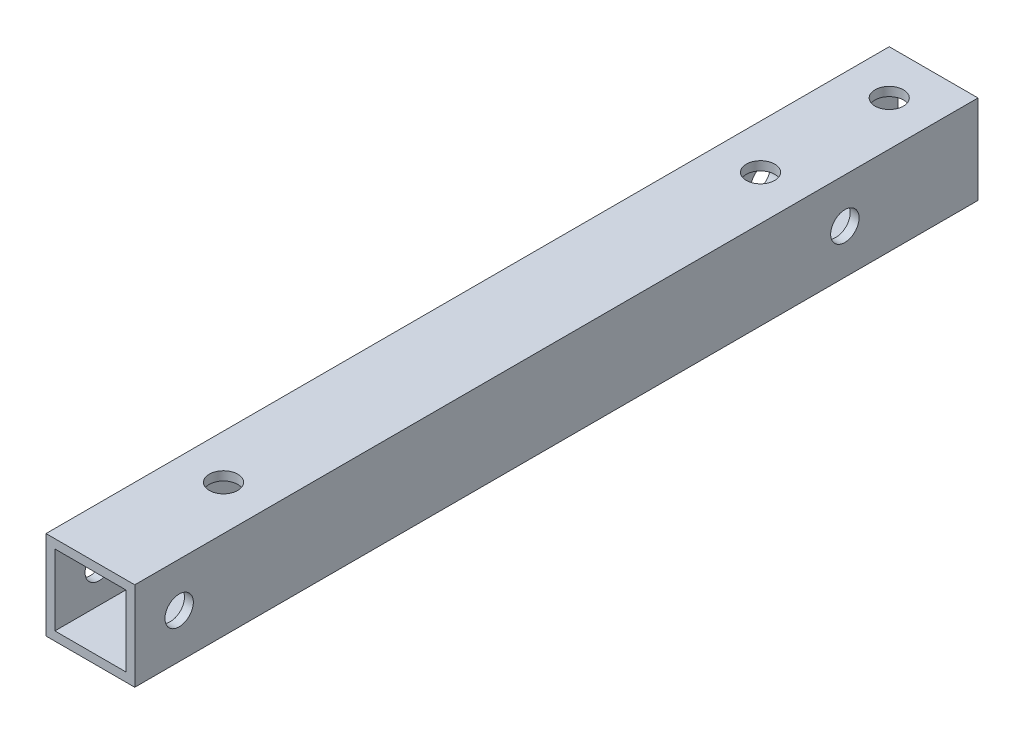
ISO-10303-21;
HEADER;
FILE_DESCRIPTION(('STEP AP214'),'2;1');
FILE_NAME('part.step','',(''),(''),'','','');
FILE_SCHEMA(('AUTOMOTIVE_DESIGN { 1 0 10303 214 1 1 1 1 }'));
ENDSEC;
DATA;
#1=APPLICATION_CONTEXT('core data for automotive mechanical design processes');
#2=APPLICATION_PROTOCOL_DEFINITION('international standard','automotive_design',2000,#1);
#3=PRODUCT_CONTEXT('',#1,'mechanical');
#4=PRODUCT('Part','Part','',(#3));
#5=PRODUCT_RELATED_PRODUCT_CATEGORY('part','',(#4));
#6=PRODUCT_DEFINITION_FORMATION('','',#4);
#7=PRODUCT_DEFINITION_CONTEXT('part definition',#1,'design');
#8=PRODUCT_DEFINITION('design','',#6,#7);
#9=PRODUCT_DEFINITION_SHAPE('','',#8);
#10=(LENGTH_UNIT() NAMED_UNIT(*) SI_UNIT(.MILLI.,.METRE.));
#11=(NAMED_UNIT(*) PLANE_ANGLE_UNIT() SI_UNIT($,.RADIAN.));
#12=(NAMED_UNIT(*) SI_UNIT($,.STERADIAN.) SOLID_ANGLE_UNIT());
#13=UNCERTAINTY_MEASURE_WITH_UNIT(LENGTH_MEASURE(1.E-05),#10,'distance_accuracy_value','');
#14=(GEOMETRIC_REPRESENTATION_CONTEXT(3) GLOBAL_UNCERTAINTY_ASSIGNED_CONTEXT((#13)) GLOBAL_UNIT_ASSIGNED_CONTEXT((#10,
#11,#12)) REPRESENTATION_CONTEXT('',''));
#15=CARTESIAN_POINT('',(0.,0.,0.));
#16=DIRECTION('',(0.,0.,1.));
#17=DIRECTION('',(1.,0.,0.));
#18=AXIS2_PLACEMENT_3D('',#15,#16,#17);
#19=CARTESIAN_POINT('',(0.,0.,95.));
#20=DIRECTION('',(0.,0.,1.));
#21=DIRECTION('',(1.,0.,0.));
#22=AXIS2_PLACEMENT_3D('',#19,#20,#21);
#23=PLANE('',#22);
#24=DIRECTION('',(0.,1.,0.));
#25=VECTOR('',#24,1.);
#26=CARTESIAN_POINT('',(5.00000000000001,4.99999999999999,95.));
#27=LINE('',#26,#25);
#28=CARTESIAN_POINT('',(5.00000000000001,-5.,95.));
#29=VERTEX_POINT('',#28);
#30=CARTESIAN_POINT('',(5.00000000000001,4.99999999999999,95.));
#31=VERTEX_POINT('',#30);
#32=EDGE_CURVE('E146',#29,#31,#27,.T.);
#33=ORIENTED_EDGE('',*,*,#32,.T.);
#34=DIRECTION('',(-1.,0.,0.));
#35=VECTOR('',#34,1.);
#36=CARTESIAN_POINT('',(-4.99999999999999,4.99999999999999,95.));
#37=LINE('',#36,#35);
#38=CARTESIAN_POINT('',(-4.99999999999999,4.99999999999999,95.));
#39=VERTEX_POINT('',#38);
#40=EDGE_CURVE('E149',#31,#39,#37,.T.);
#41=ORIENTED_EDGE('',*,*,#40,.T.);
#42=DIRECTION('',(0.,-1.,0.));
#43=VECTOR('',#42,1.);
#44=CARTESIAN_POINT('',(-4.99999999999999,4.99999999999999,95.));
#45=LINE('',#44,#43);
#46=CARTESIAN_POINT('',(-4.99999999999999,-5.,95.));
#47=VERTEX_POINT('',#46);
#48=EDGE_CURVE('E152',#39,#47,#45,.T.);
#49=ORIENTED_EDGE('',*,*,#48,.T.);
#50=DIRECTION('',(1.,0.,0.));
#51=VECTOR('',#50,1.);
#52=CARTESIAN_POINT('',(-4.99999999999999,-5.,95.));
#53=LINE('',#52,#51);
#54=EDGE_CURVE('E154',#47,#29,#53,.T.);
#55=ORIENTED_EDGE('',*,*,#54,.T.);
#56=EDGE_LOOP('',(#33,#41,#49,#55));
#57=FACE_BOUND('',#56,.T.);
#58=DIRECTION('',(-1.,0.,0.));
#59=VECTOR('',#58,1.);
#60=CARTESIAN_POINT('',(-4.,4.,95.));
#61=LINE('',#60,#59);
#62=CARTESIAN_POINT('',(4.,4.,95.));
#63=VERTEX_POINT('',#62);
#64=CARTESIAN_POINT('',(-4.,4.,95.));
#65=VERTEX_POINT('',#64);
#66=EDGE_CURVE('E116',#63,#65,#61,.T.);
#67=ORIENTED_EDGE('',*,*,#66,.F.);
#68=DIRECTION('',(0.,1.,0.));
#69=VECTOR('',#68,1.);
#70=CARTESIAN_POINT('',(4.,4.,95.));
#71=LINE('',#70,#69);
#72=CARTESIAN_POINT('',(4.,-4.,95.));
#73=VERTEX_POINT('',#72);
#74=EDGE_CURVE('E108',#73,#63,#71,.T.);
#75=ORIENTED_EDGE('',*,*,#74,.F.);
#76=DIRECTION('',(1.,0.,0.));
#77=VECTOR('',#76,1.);
#78=CARTESIAN_POINT('',(-4.,-4.,95.));
#79=LINE('',#78,#77);
#80=CARTESIAN_POINT('',(-4.,-4.,95.));
#81=VERTEX_POINT('',#80);
#82=EDGE_CURVE('E130',#81,#73,#79,.T.);
#83=ORIENTED_EDGE('',*,*,#82,.F.);
#84=DIRECTION('',(0.,-1.,0.));
#85=VECTOR('',#84,1.);
#86=CARTESIAN_POINT('',(-4.,4.,95.));
#87=LINE('',#86,#85);
#88=EDGE_CURVE('E128',#65,#81,#87,.T.);
#89=ORIENTED_EDGE('',*,*,#88,.F.);
#90=EDGE_LOOP('',(#67,#75,#83,#89));
#91=FACE_BOUND('',#90,.T.);
#92=ADVANCED_FACE('F41',(#57,#91),#23,.T.);
#93=CARTESIAN_POINT('',(0.,0.,0.));
#94=DIRECTION('',(0.,0.,1.));
#95=DIRECTION('',(1.,0.,0.));
#96=AXIS2_PLACEMENT_3D('',#93,#94,#95);
#97=PLANE('',#96);
#98=DIRECTION('',(0.,1.,0.));
#99=VECTOR('',#98,1.);
#100=CARTESIAN_POINT('',(5.00000000000001,4.99999999999999,0.));
#101=LINE('',#100,#99);
#102=CARTESIAN_POINT('',(5.00000000000001,-5.,0.));
#103=VERTEX_POINT('',#102);
#104=CARTESIAN_POINT('',(5.00000000000001,4.99999999999999,0.));
#105=VERTEX_POINT('',#104);
#106=EDGE_CURVE('E124',#103,#105,#101,.T.);
#107=ORIENTED_EDGE('',*,*,#106,.F.);
#108=DIRECTION('',(1.,0.,0.));
#109=VECTOR('',#108,1.);
#110=CARTESIAN_POINT('',(-4.99999999999999,-5.,0.));
#111=LINE('',#110,#109);
#112=CARTESIAN_POINT('',(-4.99999999999999,-5.,0.));
#113=VERTEX_POINT('',#112);
#114=EDGE_CURVE('E150',#113,#103,#111,.T.);
#115=ORIENTED_EDGE('',*,*,#114,.F.);
#116=DIRECTION('',(0.,-1.,0.));
#117=VECTOR('',#116,1.);
#118=CARTESIAN_POINT('',(-4.99999999999999,4.99999999999999,0.));
#119=LINE('',#118,#117);
#120=CARTESIAN_POINT('',(-4.99999999999999,4.99999999999999,0.));
#121=VERTEX_POINT('',#120);
#122=EDGE_CURVE('E161',#121,#113,#119,.T.);
#123=ORIENTED_EDGE('',*,*,#122,.F.);
#124=DIRECTION('',(-1.,0.,0.));
#125=VECTOR('',#124,1.);
#126=CARTESIAN_POINT('',(-4.99999999999999,4.99999999999999,0.));
#127=LINE('',#126,#125);
#128=EDGE_CURVE('E159',#105,#121,#127,.T.);
#129=ORIENTED_EDGE('',*,*,#128,.F.);
#130=EDGE_LOOP('',(#107,#115,#123,#129));
#131=FACE_BOUND('',#130,.T.);
#132=DIRECTION('',(0.,1.,0.));
#133=VECTOR('',#132,1.);
#134=CARTESIAN_POINT('',(4.,4.,0.));
#135=LINE('',#134,#133);
#136=CARTESIAN_POINT('',(4.,-4.,0.));
#137=VERTEX_POINT('',#136);
#138=CARTESIAN_POINT('',(4.,4.,0.));
#139=VERTEX_POINT('',#138);
#140=EDGE_CURVE('E66',#137,#139,#135,.T.);
#141=ORIENTED_EDGE('',*,*,#140,.T.);
#142=DIRECTION('',(-1.,0.,0.));
#143=VECTOR('',#142,1.);
#144=CARTESIAN_POINT('',(-4.,4.,0.));
#145=LINE('',#144,#143);
#146=CARTESIAN_POINT('',(-4.,4.,0.));
#147=VERTEX_POINT('',#146);
#148=EDGE_CURVE('E123',#139,#147,#145,.T.);
#149=ORIENTED_EDGE('',*,*,#148,.T.);
#150=DIRECTION('',(0.,-1.,0.));
#151=VECTOR('',#150,1.);
#152=CARTESIAN_POINT('',(-4.,4.,0.));
#153=LINE('',#152,#151);
#154=CARTESIAN_POINT('',(-4.,-4.,0.));
#155=VERTEX_POINT('',#154);
#156=EDGE_CURVE('E138',#147,#155,#153,.T.);
#157=ORIENTED_EDGE('',*,*,#156,.T.);
#158=DIRECTION('',(1.,0.,0.));
#159=VECTOR('',#158,1.);
#160=CARTESIAN_POINT('',(-4.,-4.,0.));
#161=LINE('',#160,#159);
#162=EDGE_CURVE('E117',#155,#137,#161,.T.);
#163=ORIENTED_EDGE('',*,*,#162,.T.);
#164=EDGE_LOOP('',(#141,#149,#157,#163));
#165=FACE_BOUND('',#164,.T.);
#166=ADVANCED_FACE('F264',(#131,#165),#97,.F.);
#167=CARTESIAN_POINT('',(5.00000000000001,4.99999999999999,95.));
#168=DIRECTION('',(-1.,0.,0.));
#169=DIRECTION('',(0.,-1.,0.));
#170=AXIS2_PLACEMENT_3D('',#167,#168,#169);
#171=PLANE('',#170);
#172=CARTESIAN_POINT('',(5.00000000000001,0.,15.));
#173=DIRECTION('',(-1.,0.,0.));
#174=DIRECTION('',(0.,0.,1.));
#175=AXIS2_PLACEMENT_3D('',#172,#173,#174);
#176=CIRCLE('',#175,1.6);
#177=CARTESIAN_POINT('',(5.00000000000001,0.,16.6));
#178=VERTEX_POINT('',#177);
#179=EDGE_CURVE('E185',#178,#178,#176,.T.);
#180=ORIENTED_EDGE('',*,*,#179,.T.);
#181=EDGE_LOOP('',(#180));
#182=FACE_BOUND('',#181,.T.);
#183=CARTESIAN_POINT('',(5.00000000000001,0.,90.));
#184=DIRECTION('',(-1.,0.,0.));
#185=DIRECTION('',(0.,0.,1.));
#186=AXIS2_PLACEMENT_3D('',#183,#184,#185);
#187=CIRCLE('',#186,1.60000000000001);
#188=CARTESIAN_POINT('',(5.00000000000001,0.,91.6));
#189=VERTEX_POINT('',#188);
#190=EDGE_CURVE('E196',#189,#189,#187,.T.);
#191=ORIENTED_EDGE('',*,*,#190,.T.);
#192=EDGE_LOOP('',(#191));
#193=FACE_BOUND('',#192,.T.);
#194=ORIENTED_EDGE('',*,*,#106,.T.);
#195=DIRECTION('',(0.,0.,-1.));
#196=VECTOR('',#195,1.);
#197=CARTESIAN_POINT('',(5.00000000000001,4.99999999999999,95.));
#198=LINE('',#197,#196);
#199=EDGE_CURVE('E11',#31,#105,#198,.T.);
#200=ORIENTED_EDGE('',*,*,#199,.F.);
#201=ORIENTED_EDGE('',*,*,#32,.F.);
#202=DIRECTION('',(0.,0.,-1.));
#203=VECTOR('',#202,1.);
#204=CARTESIAN_POINT('',(5.00000000000001,-5.,95.));
#205=LINE('',#204,#203);
#206=EDGE_CURVE('E156',#29,#103,#205,.T.);
#207=ORIENTED_EDGE('',*,*,#206,.T.);
#208=EDGE_LOOP('',(#194,#200,#201,#207));
#209=FACE_BOUND('',#208,.T.);
#210=ADVANCED_FACE('F43',(#182,#193,#209),#171,.F.);
#211=CARTESIAN_POINT('',(-4.99999999999999,4.99999999999999,95.));
#212=DIRECTION('',(0.,-1.,0.));
#213=DIRECTION('',(0.,0.,-1.));
#214=AXIS2_PLACEMENT_3D('',#211,#212,#213);
#215=PLANE('',#214);
#216=CARTESIAN_POINT('',(0.,4.99999999999999,5.));
#217=DIRECTION('',(0.,1.,0.));
#218=DIRECTION('',(0.,0.,1.));
#219=AXIS2_PLACEMENT_3D('',#216,#217,#218);
#220=CIRCLE('',#219,1.6);
#221=CARTESIAN_POINT('',(0.,4.99999999999999,6.6));
#222=VERTEX_POINT('',#221);
#223=EDGE_CURVE('E210',#222,#222,#220,.T.);
#224=ORIENTED_EDGE('',*,*,#223,.F.);
#225=EDGE_LOOP('',(#224));
#226=FACE_BOUND('',#225,.T.);
#227=CARTESIAN_POINT('',(0.,4.99999999999999,80.));
#228=DIRECTION('',(0.,1.,0.));
#229=DIRECTION('',(0.,0.,1.));
#230=AXIS2_PLACEMENT_3D('',#227,#228,#229);
#231=CIRCLE('',#230,1.6);
#232=CARTESIAN_POINT('',(0.,4.99999999999999,81.6));
#233=VERTEX_POINT('',#232);
#234=EDGE_CURVE('E216',#233,#233,#231,.T.);
#235=ORIENTED_EDGE('',*,*,#234,.F.);
#236=EDGE_LOOP('',(#235));
#237=FACE_BOUND('',#236,.T.);
#238=CARTESIAN_POINT('',(0.,4.99999999999999,19.5));
#239=DIRECTION('',(0.,1.,0.));
#240=DIRECTION('',(0.,0.,1.));
#241=AXIS2_PLACEMENT_3D('',#238,#239,#240);
#242=CIRCLE('',#241,1.6);
#243=CARTESIAN_POINT('',(0.,4.99999999999999,21.1));
#244=VERTEX_POINT('',#243);
#245=EDGE_CURVE('E207',#244,#244,#242,.T.);
#246=ORIENTED_EDGE('',*,*,#245,.F.);
#247=EDGE_LOOP('',(#246));
#248=FACE_BOUND('',#247,.T.);
#249=ORIENTED_EDGE('',*,*,#128,.T.);
#250=DIRECTION('',(0.,0.,-1.));
#251=VECTOR('',#250,1.);
#252=CARTESIAN_POINT('',(-4.99999999999999,4.99999999999999,95.));
#253=LINE('',#252,#251);
#254=EDGE_CURVE('E50',#39,#121,#253,.T.);
#255=ORIENTED_EDGE('',*,*,#254,.F.);
#256=ORIENTED_EDGE('',*,*,#40,.F.);
#257=ORIENTED_EDGE('',*,*,#199,.T.);
#258=EDGE_LOOP('',(#249,#255,#256,#257));
#259=FACE_BOUND('',#258,.T.);
#260=ADVANCED_FACE('F250',(#226,#237,#248,#259),#215,.F.);
#261=CARTESIAN_POINT('',(-4.99999999999999,4.99999999999999,95.));
#262=DIRECTION('',(1.,0.,0.));
#263=DIRECTION('',(0.,1.,0.));
#264=AXIS2_PLACEMENT_3D('',#261,#262,#263);
#265=PLANE('',#264);
#266=CARTESIAN_POINT('',(-4.99999999999999,0.,15.));
#267=DIRECTION('',(-1.,0.,0.));
#268=DIRECTION('',(0.,0.,1.));
#269=AXIS2_PLACEMENT_3D('',#266,#267,#268);
#270=CIRCLE('',#269,1.6);
#271=CARTESIAN_POINT('',(-4.99999999999999,0.,16.6));
#272=VERTEX_POINT('',#271);
#273=EDGE_CURVE('E191',#272,#272,#270,.T.);
#274=ORIENTED_EDGE('',*,*,#273,.F.);
#275=EDGE_LOOP('',(#274));
#276=FACE_BOUND('',#275,.T.);
#277=CARTESIAN_POINT('',(-4.99999999999999,0.,90.));
#278=DIRECTION('',(-1.,0.,0.));
#279=DIRECTION('',(0.,0.,1.));
#280=AXIS2_PLACEMENT_3D('',#277,#278,#279);
#281=CIRCLE('',#280,1.60000000000001);
#282=CARTESIAN_POINT('',(-4.99999999999999,0.,91.6));
#283=VERTEX_POINT('',#282);
#284=EDGE_CURVE('E201',#283,#283,#281,.T.);
#285=ORIENTED_EDGE('',*,*,#284,.F.);
#286=EDGE_LOOP('',(#285));
#287=FACE_BOUND('',#286,.T.);
#288=ORIENTED_EDGE('',*,*,#122,.T.);
#289=DIRECTION('',(0.,0.,-1.));
#290=VECTOR('',#289,1.);
#291=CARTESIAN_POINT('',(-4.99999999999999,-5.,95.));
#292=LINE('',#291,#290);
#293=EDGE_CURVE('E166',#47,#113,#292,.T.);
#294=ORIENTED_EDGE('',*,*,#293,.F.);
#295=ORIENTED_EDGE('',*,*,#48,.F.);
#296=ORIENTED_EDGE('',*,*,#254,.T.);
#297=EDGE_LOOP('',(#288,#294,#295,#296));
#298=FACE_BOUND('',#297,.T.);
#299=ADVANCED_FACE('F253',(#276,#287,#298),#265,.F.);
#300=CARTESIAN_POINT('',(-4.99999999999999,-5.,95.));
#301=DIRECTION('',(0.,1.,0.));
#302=DIRECTION('',(0.,0.,1.));
#303=AXIS2_PLACEMENT_3D('',#300,#301,#302);
#304=PLANE('',#303);
#305=CARTESIAN_POINT('',(0.,-5.,5.));
#306=DIRECTION('',(0.,1.,0.));
#307=DIRECTION('',(0.,0.,1.));
#308=AXIS2_PLACEMENT_3D('',#305,#306,#307);
#309=CIRCLE('',#308,1.6);
#310=CARTESIAN_POINT('',(0.,-5.,6.6));
#311=VERTEX_POINT('',#310);
#312=EDGE_CURVE('E175',#311,#311,#309,.T.);
#313=ORIENTED_EDGE('',*,*,#312,.T.);
#314=EDGE_LOOP('',(#313));
#315=FACE_BOUND('',#314,.T.);
#316=CARTESIAN_POINT('',(0.,-5.,80.));
#317=DIRECTION('',(0.,1.,0.));
#318=DIRECTION('',(0.,0.,1.));
#319=AXIS2_PLACEMENT_3D('',#316,#317,#318);
#320=CIRCLE('',#319,1.6);
#321=CARTESIAN_POINT('',(0.,-5.,81.6));
#322=VERTEX_POINT('',#321);
#323=EDGE_CURVE('E213',#322,#322,#320,.T.);
#324=ORIENTED_EDGE('',*,*,#323,.T.);
#325=EDGE_LOOP('',(#324));
#326=FACE_BOUND('',#325,.T.);
#327=CARTESIAN_POINT('',(0.,-5.,19.5));
#328=DIRECTION('',(0.,1.,0.));
#329=DIRECTION('',(0.,0.,1.));
#330=AXIS2_PLACEMENT_3D('',#327,#328,#329);
#331=CIRCLE('',#330,1.6);
#332=CARTESIAN_POINT('',(0.,-5.,21.1));
#333=VERTEX_POINT('',#332);
#334=EDGE_CURVE('E219',#333,#333,#331,.T.);
#335=ORIENTED_EDGE('',*,*,#334,.T.);
#336=EDGE_LOOP('',(#335));
#337=FACE_BOUND('',#336,.T.);
#338=ORIENTED_EDGE('',*,*,#114,.T.);
#339=ORIENTED_EDGE('',*,*,#206,.F.);
#340=ORIENTED_EDGE('',*,*,#54,.F.);
#341=ORIENTED_EDGE('',*,*,#293,.T.);
#342=EDGE_LOOP('',(#338,#339,#340,#341));
#343=FACE_BOUND('',#342,.T.);
#344=ADVANCED_FACE('F268',(#315,#326,#337,#343),#304,.F.);
#345=CARTESIAN_POINT('',(4.,4.,95.));
#346=DIRECTION('',(-1.,0.,0.));
#347=DIRECTION('',(0.,-1.,0.));
#348=AXIS2_PLACEMENT_3D('',#345,#346,#347);
#349=PLANE('',#348);
#350=CARTESIAN_POINT('',(4.,0.,15.));
#351=DIRECTION('',(-1.,0.,0.));
#352=DIRECTION('',(0.,-1.,0.));
#353=AXIS2_PLACEMENT_3D('',#350,#351,#352);
#354=CIRCLE('',#353,1.6);
#355=CARTESIAN_POINT('',(4.,-1.6,15.));
#356=VERTEX_POINT('',#355);
#357=EDGE_CURVE('E204',#356,#356,#354,.T.);
#358=ORIENTED_EDGE('',*,*,#357,.F.);
#359=EDGE_LOOP('',(#358));
#360=FACE_BOUND('',#359,.T.);
#361=CARTESIAN_POINT('',(4.,0.,90.));
#362=DIRECTION('',(-1.,0.,0.));
#363=DIRECTION('',(0.,-1.,0.));
#364=AXIS2_PLACEMENT_3D('',#361,#362,#363);
#365=CIRCLE('',#364,1.60000000000001);
#366=CARTESIAN_POINT('',(4.,-1.60000000000001,90.));
#367=VERTEX_POINT('',#366);
#368=EDGE_CURVE('E184',#367,#367,#365,.T.);
#369=ORIENTED_EDGE('',*,*,#368,.F.);
#370=EDGE_LOOP('',(#369));
#371=FACE_BOUND('',#370,.T.);
#372=ORIENTED_EDGE('',*,*,#140,.F.);
#373=DIRECTION('',(0.,0.,-1.));
#374=VECTOR('',#373,1.);
#375=CARTESIAN_POINT('',(4.,-4.,95.));
#376=LINE('',#375,#374);
#377=EDGE_CURVE('E112',#73,#137,#376,.T.);
#378=ORIENTED_EDGE('',*,*,#377,.F.);
#379=ORIENTED_EDGE('',*,*,#74,.T.);
#380=DIRECTION('',(0.,0.,-1.));
#381=VECTOR('',#380,1.);
#382=CARTESIAN_POINT('',(4.,4.,95.));
#383=LINE('',#382,#381);
#384=EDGE_CURVE('E111',#63,#139,#383,.T.);
#385=ORIENTED_EDGE('',*,*,#384,.T.);
#386=EDGE_LOOP('',(#372,#378,#379,#385));
#387=FACE_BOUND('',#386,.T.);
#388=ADVANCED_FACE('F110',(#360,#371,#387),#349,.T.);
#389=CARTESIAN_POINT('',(-4.,4.,95.));
#390=DIRECTION('',(0.,-1.,0.));
#391=DIRECTION('',(0.,0.,-1.));
#392=AXIS2_PLACEMENT_3D('',#389,#390,#391);
#393=PLANE('',#392);
#394=CARTESIAN_POINT('',(0.,4.,5.));
#395=DIRECTION('',(0.,-1.,0.));
#396=DIRECTION('',(0.,0.,-1.));
#397=AXIS2_PLACEMENT_3D('',#394,#395,#396);
#398=CIRCLE('',#397,1.6);
#399=CARTESIAN_POINT('',(0.,4.,3.4));
#400=VERTEX_POINT('',#399);
#401=EDGE_CURVE('E136',#400,#400,#398,.T.);
#402=ORIENTED_EDGE('',*,*,#401,.F.);
#403=EDGE_LOOP('',(#402));
#404=FACE_BOUND('',#403,.T.);
#405=CARTESIAN_POINT('',(0.,4.,80.));
#406=DIRECTION('',(0.,-1.,0.));
#407=DIRECTION('',(0.,0.,-1.));
#408=AXIS2_PLACEMENT_3D('',#405,#406,#407);
#409=CIRCLE('',#408,1.6);
#410=CARTESIAN_POINT('',(0.,4.,78.4));
#411=VERTEX_POINT('',#410);
#412=EDGE_CURVE('E179',#411,#411,#409,.T.);
#413=ORIENTED_EDGE('',*,*,#412,.F.);
#414=EDGE_LOOP('',(#413));
#415=FACE_BOUND('',#414,.T.);
#416=CARTESIAN_POINT('',(0.,4.,19.5));
#417=DIRECTION('',(0.,-1.,0.));
#418=DIRECTION('',(0.,0.,-1.));
#419=AXIS2_PLACEMENT_3D('',#416,#417,#418);
#420=CIRCLE('',#419,1.6);
#421=CARTESIAN_POINT('',(0.,4.,17.9));
#422=VERTEX_POINT('',#421);
#423=EDGE_CURVE('E174',#422,#422,#420,.T.);
#424=ORIENTED_EDGE('',*,*,#423,.F.);
#425=EDGE_LOOP('',(#424));
#426=FACE_BOUND('',#425,.T.);
#427=ORIENTED_EDGE('',*,*,#148,.F.);
#428=ORIENTED_EDGE('',*,*,#384,.F.);
#429=ORIENTED_EDGE('',*,*,#66,.T.);
#430=DIRECTION('',(0.,0.,-1.));
#431=VECTOR('',#430,1.);
#432=CARTESIAN_POINT('',(-4.,4.,95.));
#433=LINE('',#432,#431);
#434=EDGE_CURVE('E125',#65,#147,#433,.T.);
#435=ORIENTED_EDGE('',*,*,#434,.T.);
#436=EDGE_LOOP('',(#427,#428,#429,#435));
#437=FACE_BOUND('',#436,.T.);
#438=ADVANCED_FACE('F120',(#404,#415,#426,#437),#393,.T.);
#439=CARTESIAN_POINT('',(-4.,4.,95.));
#440=DIRECTION('',(1.,0.,0.));
#441=DIRECTION('',(0.,1.,0.));
#442=AXIS2_PLACEMENT_3D('',#439,#440,#441);
#443=PLANE('',#442);
#444=CARTESIAN_POINT('',(-4.,0.,15.));
#445=DIRECTION('',(1.,0.,0.));
#446=DIRECTION('',(0.,1.,0.));
#447=AXIS2_PLACEMENT_3D('',#444,#445,#446);
#448=CIRCLE('',#447,1.6);
#449=CARTESIAN_POINT('',(-4.,1.6,15.));
#450=VERTEX_POINT('',#449);
#451=EDGE_CURVE('E45',#450,#450,#448,.T.);
#452=ORIENTED_EDGE('',*,*,#451,.F.);
#453=EDGE_LOOP('',(#452));
#454=FACE_BOUND('',#453,.T.);
#455=CARTESIAN_POINT('',(-4.,0.,90.));
#456=DIRECTION('',(1.,0.,0.));
#457=DIRECTION('',(0.,1.,0.));
#458=AXIS2_PLACEMENT_3D('',#455,#456,#457);
#459=CIRCLE('',#458,1.60000000000001);
#460=CARTESIAN_POINT('',(-4.,1.60000000000001,90.));
#461=VERTEX_POINT('',#460);
#462=EDGE_CURVE('E182',#461,#461,#459,.T.);
#463=ORIENTED_EDGE('',*,*,#462,.F.);
#464=EDGE_LOOP('',(#463));
#465=FACE_BOUND('',#464,.T.);
#466=ORIENTED_EDGE('',*,*,#156,.F.);
#467=ORIENTED_EDGE('',*,*,#434,.F.);
#468=ORIENTED_EDGE('',*,*,#88,.T.);
#469=DIRECTION('',(0.,0.,-1.));
#470=VECTOR('',#469,1.);
#471=CARTESIAN_POINT('',(-4.,-4.,95.));
#472=LINE('',#471,#470);
#473=EDGE_CURVE('E58',#81,#155,#472,.T.);
#474=ORIENTED_EDGE('',*,*,#473,.T.);
#475=EDGE_LOOP('',(#466,#467,#468,#474));
#476=FACE_BOUND('',#475,.T.);
#477=ADVANCED_FACE('F235',(#454,#465,#476),#443,.T.);
#478=CARTESIAN_POINT('',(-4.,-4.,95.));
#479=DIRECTION('',(0.,1.,0.));
#480=DIRECTION('',(0.,0.,1.));
#481=AXIS2_PLACEMENT_3D('',#478,#479,#480);
#482=PLANE('',#481);
#483=CARTESIAN_POINT('',(0.,-4.,5.));
#484=DIRECTION('',(0.,1.,0.));
#485=DIRECTION('',(0.,0.,1.));
#486=AXIS2_PLACEMENT_3D('',#483,#484,#485);
#487=CIRCLE('',#486,1.6);
#488=CARTESIAN_POINT('',(0.,-4.,6.6));
#489=VERTEX_POINT('',#488);
#490=EDGE_CURVE('E180',#489,#489,#487,.T.);
#491=ORIENTED_EDGE('',*,*,#490,.F.);
#492=EDGE_LOOP('',(#491));
#493=FACE_BOUND('',#492,.T.);
#494=CARTESIAN_POINT('',(0.,-4.,80.));
#495=DIRECTION('',(0.,1.,0.));
#496=DIRECTION('',(0.,0.,1.));
#497=AXIS2_PLACEMENT_3D('',#494,#495,#496);
#498=CIRCLE('',#497,1.6);
#499=CARTESIAN_POINT('',(0.,-4.,81.6));
#500=VERTEX_POINT('',#499);
#501=EDGE_CURVE('E176',#500,#500,#498,.T.);
#502=ORIENTED_EDGE('',*,*,#501,.F.);
#503=EDGE_LOOP('',(#502));
#504=FACE_BOUND('',#503,.T.);
#505=CARTESIAN_POINT('',(0.,-4.,19.5));
#506=DIRECTION('',(0.,1.,0.));
#507=DIRECTION('',(0.,0.,1.));
#508=AXIS2_PLACEMENT_3D('',#505,#506,#507);
#509=CIRCLE('',#508,1.6);
#510=CARTESIAN_POINT('',(0.,-4.,21.1));
#511=VERTEX_POINT('',#510);
#512=EDGE_CURVE('E171',#511,#511,#509,.T.);
#513=ORIENTED_EDGE('',*,*,#512,.F.);
#514=EDGE_LOOP('',(#513));
#515=FACE_BOUND('',#514,.T.);
#516=ORIENTED_EDGE('',*,*,#162,.F.);
#517=ORIENTED_EDGE('',*,*,#473,.F.);
#518=ORIENTED_EDGE('',*,*,#82,.T.);
#519=ORIENTED_EDGE('',*,*,#377,.T.);
#520=EDGE_LOOP('',(#516,#517,#518,#519));
#521=FACE_BOUND('',#520,.T.);
#522=ADVANCED_FACE('F352',(#493,#504,#515,#521),#482,.T.);
#523=CARTESIAN_POINT('',(0.,-5.,19.5));
#524=DIRECTION('',(0.,1.,0.));
#525=DIRECTION('',(0.,0.,1.));
#526=AXIS2_PLACEMENT_3D('',#523,#524,#525);
#527=CYLINDRICAL_SURFACE('',#526,1.6);
#528=ORIENTED_EDGE('',*,*,#512,.T.);
#529=EDGE_LOOP('',(#528));
#530=FACE_BOUND('',#529,.T.);
#531=ORIENTED_EDGE('',*,*,#334,.F.);
#532=EDGE_LOOP('',(#531));
#533=FACE_BOUND('',#532,.T.);
#534=ADVANCED_FACE('F247',(#530,#533),#527,.F.);
#535=CARTESIAN_POINT('',(0.,-5.,80.));
#536=DIRECTION('',(0.,1.,0.));
#537=DIRECTION('',(0.,0.,1.));
#538=AXIS2_PLACEMENT_3D('',#535,#536,#537);
#539=CYLINDRICAL_SURFACE('',#538,1.6);
#540=ORIENTED_EDGE('',*,*,#501,.T.);
#541=EDGE_LOOP('',(#540));
#542=FACE_BOUND('',#541,.T.);
#543=ORIENTED_EDGE('',*,*,#323,.F.);
#544=EDGE_LOOP('',(#543));
#545=FACE_BOUND('',#544,.T.);
#546=ADVANCED_FACE('F367',(#542,#545),#539,.F.);
#547=CARTESIAN_POINT('',(0.,-5.,5.));
#548=DIRECTION('',(0.,1.,0.));
#549=DIRECTION('',(0.,0.,1.));
#550=AXIS2_PLACEMENT_3D('',#547,#548,#549);
#551=CYLINDRICAL_SURFACE('',#550,1.6);
#552=ORIENTED_EDGE('',*,*,#490,.T.);
#553=EDGE_LOOP('',(#552));
#554=FACE_BOUND('',#553,.T.);
#555=ORIENTED_EDGE('',*,*,#312,.F.);
#556=EDGE_LOOP('',(#555));
#557=FACE_BOUND('',#556,.T.);
#558=ADVANCED_FACE('F245',(#554,#557),#551,.F.);
#559=ORIENTED_EDGE('',*,*,#423,.T.);
#560=EDGE_LOOP('',(#559));
#561=FACE_BOUND('',#560,.T.);
#562=ORIENTED_EDGE('',*,*,#245,.T.);
#563=EDGE_LOOP('',(#562));
#564=FACE_BOUND('',#563,.T.);
#565=ADVANCED_FACE('F241',(#561,#564),#527,.F.);
#566=ORIENTED_EDGE('',*,*,#412,.T.);
#567=EDGE_LOOP('',(#566));
#568=FACE_BOUND('',#567,.T.);
#569=ORIENTED_EDGE('',*,*,#234,.T.);
#570=EDGE_LOOP('',(#569));
#571=FACE_BOUND('',#570,.T.);
#572=ADVANCED_FACE('F244',(#568,#571),#539,.F.);
#573=ORIENTED_EDGE('',*,*,#401,.T.);
#574=EDGE_LOOP('',(#573));
#575=FACE_BOUND('',#574,.T.);
#576=ORIENTED_EDGE('',*,*,#223,.T.);
#577=EDGE_LOOP('',(#576));
#578=FACE_BOUND('',#577,.T.);
#579=ADVANCED_FACE('F230',(#575,#578),#551,.F.);
#580=CARTESIAN_POINT('',(5.00000000000001,0.,90.));
#581=DIRECTION('',(-1.,0.,0.));
#582=DIRECTION('',(0.,0.,1.));
#583=AXIS2_PLACEMENT_3D('',#580,#581,#582);
#584=CYLINDRICAL_SURFACE('',#583,1.60000000000001);
#585=ORIENTED_EDGE('',*,*,#462,.T.);
#586=EDGE_LOOP('',(#585));
#587=FACE_BOUND('',#586,.T.);
#588=ORIENTED_EDGE('',*,*,#284,.T.);
#589=EDGE_LOOP('',(#588));
#590=FACE_BOUND('',#589,.T.);
#591=ADVANCED_FACE('F292',(#587,#590),#584,.F.);
#592=CARTESIAN_POINT('',(5.00000000000001,0.,15.));
#593=DIRECTION('',(-1.,0.,0.));
#594=DIRECTION('',(0.,0.,1.));
#595=AXIS2_PLACEMENT_3D('',#592,#593,#594);
#596=CYLINDRICAL_SURFACE('',#595,1.6);
#597=ORIENTED_EDGE('',*,*,#451,.T.);
#598=EDGE_LOOP('',(#597));
#599=FACE_BOUND('',#598,.T.);
#600=ORIENTED_EDGE('',*,*,#273,.T.);
#601=EDGE_LOOP('',(#600));
#602=FACE_BOUND('',#601,.T.);
#603=ADVANCED_FACE('F294',(#599,#602),#596,.F.);
#604=ORIENTED_EDGE('',*,*,#368,.T.);
#605=EDGE_LOOP('',(#604));
#606=FACE_BOUND('',#605,.T.);
#607=ORIENTED_EDGE('',*,*,#190,.F.);
#608=EDGE_LOOP('',(#607));
#609=FACE_BOUND('',#608,.T.);
#610=ADVANCED_FACE('F296',(#606,#609),#584,.F.);
#611=ORIENTED_EDGE('',*,*,#357,.T.);
#612=EDGE_LOOP('',(#611));
#613=FACE_BOUND('',#612,.T.);
#614=ORIENTED_EDGE('',*,*,#179,.F.);
#615=EDGE_LOOP('',(#614));
#616=FACE_BOUND('',#615,.T.);
#617=ADVANCED_FACE('F303',(#613,#616),#596,.F.);
#618=CLOSED_SHELL('',(#92,#166,#210,#260,#299,#344,#388,#438,#477,#522,#534,#546,#558,#565,#572,
#579,#591,#603,#610,#617));
#619=MANIFOLD_SOLID_BREP('B2',#618);
#620=ADVANCED_BREP_SHAPE_REPRESENTATION('',(#18,#619),#14);
#621=SHAPE_DEFINITION_REPRESENTATION(#9,#620);
ENDSEC;
END-ISO-10303-21;
